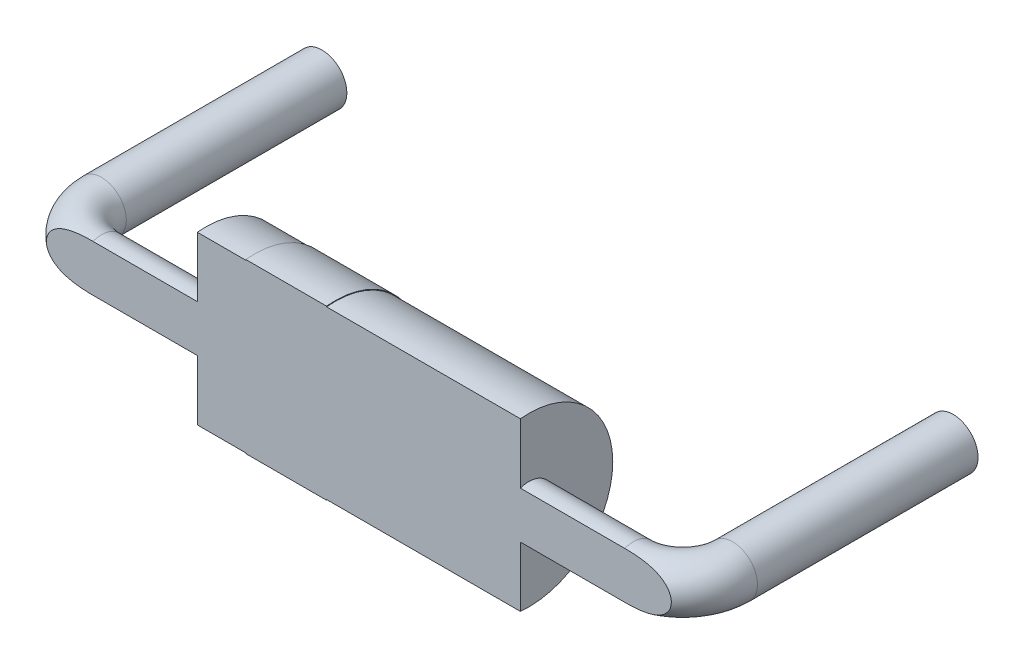
ISO-10303-21;
HEADER;
FILE_DESCRIPTION(('STEP AP214'),'2;1');
FILE_NAME('part.step','',(''),(''),'','','');
FILE_SCHEMA(('AUTOMOTIVE_DESIGN { 1 0 10303 214 1 1 1 1 }'));
ENDSEC;
DATA;
#1=APPLICATION_CONTEXT('core data for automotive mechanical design processes');
#2=APPLICATION_PROTOCOL_DEFINITION('international standard','automotive_design',2000,#1);
#3=PRODUCT_CONTEXT('',#1,'mechanical');
#4=PRODUCT('Part','Part','',(#3));
#5=PRODUCT_RELATED_PRODUCT_CATEGORY('part','',(#4));
#6=PRODUCT_DEFINITION_FORMATION('','',#4);
#7=PRODUCT_DEFINITION_CONTEXT('part definition',#1,'design');
#8=PRODUCT_DEFINITION('design','',#6,#7);
#9=PRODUCT_DEFINITION_SHAPE('','',#8);
#10=(LENGTH_UNIT() NAMED_UNIT(*) SI_UNIT(.MILLI.,.METRE.));
#11=(NAMED_UNIT(*) PLANE_ANGLE_UNIT() SI_UNIT($,.RADIAN.));
#12=(NAMED_UNIT(*) SI_UNIT($,.STERADIAN.) SOLID_ANGLE_UNIT());
#13=UNCERTAINTY_MEASURE_WITH_UNIT(LENGTH_MEASURE(1.E-05),#10,'distance_accuracy_value','');
#14=(GEOMETRIC_REPRESENTATION_CONTEXT(3) GLOBAL_UNCERTAINTY_ASSIGNED_CONTEXT((#13)) GLOBAL_UNIT_ASSIGNED_CONTEXT((#10,
#11,#12)) REPRESENTATION_CONTEXT('',''));
#15=CARTESIAN_POINT('',(0.,0.,0.));
#16=DIRECTION('',(0.,0.,1.));
#17=DIRECTION('',(1.,0.,0.));
#18=AXIS2_PLACEMENT_3D('',#15,#16,#17);
#19=CARTESIAN_POINT('',(10.16,-0.4,-2.5));
#20=DIRECTION('',(0.,0.,1.));
#21=DIRECTION('',(1.,0.,0.));
#22=AXIS2_PLACEMENT_3D('',#19,#20,#21);
#23=PLANE('',#22);
#24=CARTESIAN_POINT('',(10.16,-1.30268481103693E-13,-2.5));
#25=DIRECTION('',(0.,0.,-1.));
#26=DIRECTION('',(-0.829113924050761,-0.559079691050524,0.));
#27=AXIS2_PLACEMENT_3D('',#24,#25,#26);
#28=CIRCLE('',#27,0.400000000000038);
#29=CARTESIAN_POINT('',(9.76,0.,-2.5));
#30=VERTEX_POINT('',#29);
#31=EDGE_CURVE('E11',#30,#30,#28,.T.);
#32=ORIENTED_EDGE('',*,*,#31,.T.);
#33=EDGE_LOOP('',(#32));
#34=FACE_BOUND('',#33,.T.);
#35=ADVANCED_FACE('F17',(#34),#23,.F.);
#36=CARTESIAN_POINT('',(0.,-0.4,-2.5));
#37=DIRECTION('',(0.,0.,-1.));
#38=DIRECTION('',(0.,-1.,0.));
#39=AXIS2_PLACEMENT_3D('',#36,#37,#38);
#40=PLANE('',#39);
#41=CARTESIAN_POINT('',(0.,-1.33384425739838E-13,-2.5));
#42=DIRECTION('',(0.,0.,1.));
#43=DIRECTION('',(0.829113924050766,-0.559079691050516,0.));
#44=AXIS2_PLACEMENT_3D('',#41,#42,#43);
#45=CIRCLE('',#44,0.400000000000038);
#46=CARTESIAN_POINT('',(0.4,0.,-2.5));
#47=VERTEX_POINT('',#46);
#48=EDGE_CURVE('E156',#47,#47,#45,.T.);
#49=ORIENTED_EDGE('',*,*,#48,.F.);
#50=EDGE_LOOP('',(#49));
#51=FACE_BOUND('',#50,.T.);
#52=ADVANCED_FACE('F19',(#51),#40,.T.);
#53=CARTESIAN_POINT('',(10.1599999999998,0.,1.05));
#54=DIRECTION('',(0.,0.,1.));
#55=DIRECTION('',(1.,-5.51108286165929E-13,0.));
#56=AXIS2_PLACEMENT_3D('',#53,#54,#55);
#57=CYLINDRICAL_SURFACE('',#56,0.400000000000236);
#58=CARTESIAN_POINT('',(10.16,1.3246638275554E-13,1.05));
#59=DIRECTION('',(0.,0.,1.));
#60=DIRECTION('',(-0.829113924050646,0.559079691050694,0.));
#61=AXIS2_PLACEMENT_3D('',#58,#59,#60);
#62=CIRCLE('',#61,0.400000000000038);
#63=CARTESIAN_POINT('',(9.76,0.,1.05));
#64=VERTEX_POINT('',#63);
#65=EDGE_CURVE('E291',#64,#64,#62,.T.);
#66=ORIENTED_EDGE('',*,*,#65,.F.);
#67=DIRECTION('',(0.,0.,-1.));
#68=VECTOR('',#67,1.);
#69=CARTESIAN_POINT('',(9.75999999999953,2.20550891258329E-13,1.05));
#70=LINE('',#69,#68);
#71=EDGE_CURVE('E28',#64,#30,#70,.T.);
#72=ORIENTED_EDGE('',*,*,#71,.T.);
#73=ORIENTED_EDGE('',*,*,#31,.F.);
#74=ORIENTED_EDGE('',*,*,#71,.F.);
#75=EDGE_LOOP('',(#66,#72,#73,#74));
#76=FACE_BOUND('',#75,.T.);
#77=ADVANCED_FACE('F367',(#76),#57,.T.);
#78=CARTESIAN_POINT('',(2.35020336525338E-13,0.,-2.5));
#79=DIRECTION('',(0.,0.,-1.));
#80=DIRECTION('',(-1.,-5.51477655248606E-13,0.));
#81=AXIS2_PLACEMENT_3D('',#78,#79,#80);
#82=CYLINDRICAL_SURFACE('',#81,0.400000000000235);
#83=ORIENTED_EDGE('',*,*,#48,.T.);
#84=DIRECTION('',(0.,0.,1.));
#85=VECTOR('',#84,1.);
#86=CARTESIAN_POINT('',(0.40000000000047,2.20568830768313E-13,-2.5));
#87=LINE('',#86,#85);
#88=CARTESIAN_POINT('',(0.4,0.,1.05));
#89=VERTEX_POINT('',#88);
#90=EDGE_CURVE('E160',#47,#89,#87,.T.);
#91=ORIENTED_EDGE('',*,*,#90,.T.);
#92=CARTESIAN_POINT('',(0.,-1.32922599687569E-13,1.05));
#93=DIRECTION('',(0.,0.,1.));
#94=DIRECTION('',(0.829113924050766,-0.559079691050516,0.));
#95=AXIS2_PLACEMENT_3D('',#92,#93,#94);
#96=CIRCLE('',#95,0.400000000000038);
#97=EDGE_CURVE('E123',#89,#89,#96,.T.);
#98=ORIENTED_EDGE('',*,*,#97,.F.);
#99=ORIENTED_EDGE('',*,*,#90,.F.);
#100=EDGE_LOOP('',(#83,#91,#98,#99));
#101=FACE_BOUND('',#100,.T.);
#102=ADVANCED_FACE('F372',(#101),#82,.T.);
#103=CARTESIAN_POINT('',(7.68,0.,1.84999999999977));
#104=DIRECTION('',(-1.,0.,0.));
#105=DIRECTION('',(0.,1.03805409001884E-13,-1.));
#106=AXIS2_PLACEMENT_3D('',#103,#104,#105);
#107=CYLINDRICAL_SURFACE('',#106,0.400000000000234);
#108=DIRECTION('',(-1.,0.,0.));
#109=VECTOR('',#108,1.);
#110=CARTESIAN_POINT('',(7.68,-0.375807131385399,1.987));
#111=LINE('',#110,#109);
#112=CARTESIAN_POINT('',(9.36,-0.375807131385423,1.987));
#113=VERTEX_POINT('',#112);
#114=CARTESIAN_POINT('',(7.68,-0.375807131385423,1.987));
#115=VERTEX_POINT('',#114);
#116=EDGE_CURVE('E282',#113,#115,#111,.T.);
#117=ORIENTED_EDGE('',*,*,#116,.T.);
#118=CARTESIAN_POINT('',(7.68,-1.32685403529592E-13,1.85000000000004));
#119=DIRECTION('',(1.,0.,0.));
#120=DIRECTION('',(0.,-0.559079691050516,-0.829113924050766));
#121=AXIS2_PLACEMENT_3D('',#118,#119,#120);
#122=CIRCLE('',#121,0.400000000000038);
#123=CARTESIAN_POINT('',(7.68,0.375807131385157,1.987));
#124=VERTEX_POINT('',#123);
#125=EDGE_CURVE('E153',#115,#124,#122,.T.);
#126=ORIENTED_EDGE('',*,*,#125,.T.);
#127=DIRECTION('',(1.,0.,0.));
#128=VECTOR('',#127,1.);
#129=CARTESIAN_POINT('',(7.68,0.3758071313854,1.987));
#130=LINE('',#129,#128);
#131=CARTESIAN_POINT('',(9.36,0.375807131385157,1.987));
#132=VERTEX_POINT('',#131);
#133=EDGE_CURVE('E287',#124,#132,#130,.T.);
#134=ORIENTED_EDGE('',*,*,#133,.T.);
#135=CARTESIAN_POINT('',(9.36,-1.32685403529592E-13,1.85000000000004));
#136=DIRECTION('',(1.,0.,0.));
#137=DIRECTION('',(0.,-0.559079691050516,-0.829113924050766));
#138=AXIS2_PLACEMENT_3D('',#135,#136,#137);
#139=CIRCLE('',#138,0.400000000000038);
#140=CARTESIAN_POINT('',(9.36,2.00776801527536E-13,1.45));
#141=VERTEX_POINT('',#140);
#142=EDGE_CURVE('E130',#141,#132,#139,.T.);
#143=ORIENTED_EDGE('',*,*,#142,.F.);
#144=CARTESIAN_POINT('',(9.36,-1.32685403529592E-13,1.85000000000004));
#145=DIRECTION('',(1.,0.,0.));
#146=DIRECTION('',(0.,-0.559079691050516,-0.829113924050766));
#147=AXIS2_PLACEMENT_3D('',#144,#145,#146);
#148=CIRCLE('',#147,0.400000000000038);
#149=EDGE_CURVE('E250',#113,#141,#148,.T.);
#150=ORIENTED_EDGE('',*,*,#149,.F.);
#151=EDGE_LOOP('',(#117,#126,#134,#143,#150));
#152=FACE_BOUND('',#151,.T.);
#153=ADVANCED_FACE('F378',(#152),#107,.T.);
#154=CARTESIAN_POINT('',(7.68,1.35,1.85));
#155=DIRECTION('',(1.,0.,0.));
#156=DIRECTION('',(0.,1.,0.));
#157=AXIS2_PLACEMENT_3D('',#154,#155,#156);
#158=PLANE('',#157);
#159=DIRECTION('',(0.,-1.,0.));
#160=VECTOR('',#159,1.);
#161=CARTESIAN_POINT('',(7.68,8.17225999999577,1.987));
#162=LINE('',#161,#160);
#163=CARTESIAN_POINT('',(7.68,-1.34303052832018,1.987));
#164=VERTEX_POINT('',#163);
#165=EDGE_CURVE('E278',#115,#164,#162,.T.);
#166=ORIENTED_EDGE('',*,*,#165,.T.);
#167=CARTESIAN_POINT('',(7.68,0.,1.85));
#168=DIRECTION('',(1.,0.,0.));
#169=DIRECTION('',(0.,0.559079691050539,0.829113924050751));
#170=AXIS2_PLACEMENT_3D('',#167,#168,#169);
#171=CIRCLE('',#170,1.35);
#172=CARTESIAN_POINT('',(7.68,1.3430305283202,1.987));
#173=VERTEX_POINT('',#172);
#174=EDGE_CURVE('E150',#164,#173,#171,.T.);
#175=ORIENTED_EDGE('',*,*,#174,.T.);
#176=DIRECTION('',(0.,-1.,0.));
#177=VECTOR('',#176,1.);
#178=CARTESIAN_POINT('',(7.68,8.17225999999577,1.987));
#179=LINE('',#178,#177);
#180=EDGE_CURVE('E283',#173,#124,#179,.T.);
#181=ORIENTED_EDGE('',*,*,#180,.T.);
#182=ORIENTED_EDGE('',*,*,#125,.F.);
#183=EDGE_LOOP('',(#166,#175,#181,#182));
#184=FACE_BOUND('',#183,.T.);
#185=ADVANCED_FACE('F382',(#184),#158,.T.);
#186=CARTESIAN_POINT('',(4.56,0.,1.85));
#187=DIRECTION('',(-1.,0.,0.));
#188=DIRECTION('',(0.,5.51439225670582E-13,-1.));
#189=AXIS2_PLACEMENT_3D('',#186,#187,#188);
#190=CYLINDRICAL_SURFACE('',#189,1.35);
#191=DIRECTION('',(-1.,0.,0.));
#192=VECTOR('',#191,1.);
#193=CARTESIAN_POINT('',(4.56,-1.3430305283202,1.987));
#194=LINE('',#193,#192);
#195=CARTESIAN_POINT('',(4.56,-1.34303052832018,1.987));
#196=VERTEX_POINT('',#195);
#197=EDGE_CURVE('E271',#164,#196,#194,.T.);
#198=ORIENTED_EDGE('',*,*,#197,.T.);
#199=CARTESIAN_POINT('',(4.56,0.,1.85));
#200=DIRECTION('',(1.,0.,0.));
#201=DIRECTION('',(0.,0.559079691050539,0.829113924050751));
#202=AXIS2_PLACEMENT_3D('',#199,#200,#201);
#203=CIRCLE('',#202,1.35);
#204=CARTESIAN_POINT('',(4.56,1.3430305283202,1.987));
#205=VERTEX_POINT('',#204);
#206=EDGE_CURVE('E147',#196,#205,#203,.T.);
#207=ORIENTED_EDGE('',*,*,#206,.T.);
#208=DIRECTION('',(1.,0.,0.));
#209=VECTOR('',#208,1.);
#210=CARTESIAN_POINT('',(4.56,1.3430305283202,1.987));
#211=LINE('',#210,#209);
#212=EDGE_CURVE('E251',#205,#173,#211,.T.);
#213=ORIENTED_EDGE('',*,*,#212,.T.);
#214=ORIENTED_EDGE('',*,*,#174,.F.);
#215=EDGE_LOOP('',(#198,#207,#213,#214));
#216=FACE_BOUND('',#215,.T.);
#217=ADVANCED_FACE('F387',(#216),#190,.T.);
#218=CARTESIAN_POINT('',(4.56,1.36,1.85));
#219=DIRECTION('',(1.,0.,0.));
#220=DIRECTION('',(0.,1.,0.));
#221=AXIS2_PLACEMENT_3D('',#218,#219,#220);
#222=PLANE('',#221);
#223=DIRECTION('',(0.,-1.,0.));
#224=VECTOR('',#223,1.);
#225=CARTESIAN_POINT('',(4.56,8.17725999999577,1.987));
#226=LINE('',#225,#224);
#227=CARTESIAN_POINT('',(4.56,-1.35308203742412,1.987));
#228=VERTEX_POINT('',#227);
#229=EDGE_CURVE('E267',#196,#228,#226,.T.);
#230=ORIENTED_EDGE('',*,*,#229,.T.);
#231=CARTESIAN_POINT('',(4.56,0.,1.84999999999997));
#232=DIRECTION('',(1.,0.,0.));
#233=DIRECTION('',(0.,0.559079691050534,0.829113924050754));
#234=AXIS2_PLACEMENT_3D('',#231,#232,#233);
#235=CIRCLE('',#234,1.36000000000003);
#236=CARTESIAN_POINT('',(4.56,1.35308203742432,1.987));
#237=VERTEX_POINT('',#236);
#238=EDGE_CURVE('E146',#228,#237,#235,.T.);
#239=ORIENTED_EDGE('',*,*,#238,.T.);
#240=DIRECTION('',(0.,-1.,0.));
#241=VECTOR('',#240,1.);
#242=CARTESIAN_POINT('',(4.56,8.17725999999577,1.987));
#243=LINE('',#242,#241);
#244=EDGE_CURVE('E246',#237,#205,#243,.T.);
#245=ORIENTED_EDGE('',*,*,#244,.T.);
#246=ORIENTED_EDGE('',*,*,#206,.F.);
#247=EDGE_LOOP('',(#230,#239,#245,#246));
#248=FACE_BOUND('',#247,.T.);
#249=ADVANCED_FACE('F395',(#248),#222,.T.);
#250=CARTESIAN_POINT('',(3.26,0.,1.85000000000017));
#251=DIRECTION('',(-1.,0.,0.));
#252=DIRECTION('',(0.,5.51533034688997E-13,-1.));
#253=AXIS2_PLACEMENT_3D('',#250,#251,#252);
#254=CYLINDRICAL_SURFACE('',#253,1.36000000000017);
#255=DIRECTION('',(-1.,0.,0.));
#256=VECTOR('',#255,1.);
#257=CARTESIAN_POINT('',(3.26,-1.35308203742438,1.987));
#258=LINE('',#257,#256);
#259=CARTESIAN_POINT('',(3.26,-1.35308203742412,1.987));
#260=VERTEX_POINT('',#259);
#261=EDGE_CURVE('E256',#228,#260,#258,.T.);
#262=ORIENTED_EDGE('',*,*,#261,.T.);
#263=CARTESIAN_POINT('',(3.26,0.,1.84999999999997));
#264=DIRECTION('',(1.,0.,0.));
#265=DIRECTION('',(0.,0.559079691050534,0.829113924050754));
#266=AXIS2_PLACEMENT_3D('',#263,#264,#265);
#267=CIRCLE('',#266,1.36000000000003);
#268=CARTESIAN_POINT('',(3.26,1.35308203742432,1.987));
#269=VERTEX_POINT('',#268);
#270=EDGE_CURVE('E142',#260,#269,#267,.T.);
#271=ORIENTED_EDGE('',*,*,#270,.T.);
#272=DIRECTION('',(1.,0.,0.));
#273=VECTOR('',#272,1.);
#274=CARTESIAN_POINT('',(3.26,1.35308203742438,1.987));
#275=LINE('',#274,#273);
#276=EDGE_CURVE('E355',#269,#237,#275,.T.);
#277=ORIENTED_EDGE('',*,*,#276,.T.);
#278=ORIENTED_EDGE('',*,*,#238,.F.);
#279=EDGE_LOOP('',(#262,#271,#277,#278));
#280=FACE_BOUND('',#279,.T.);
#281=ADVANCED_FACE('F392',(#280),#254,.T.);
#282=CARTESIAN_POINT('',(3.26,1.36,1.85));
#283=DIRECTION('',(1.,0.,0.));
#284=DIRECTION('',(0.,1.,0.));
#285=AXIS2_PLACEMENT_3D('',#282,#283,#284);
#286=PLANE('',#285);
#287=DIRECTION('',(0.,1.,0.));
#288=VECTOR('',#287,1.);
#289=CARTESIAN_POINT('',(3.26,8.17725999999577,1.987));
#290=LINE('',#289,#288);
#291=CARTESIAN_POINT('',(3.26,-1.34303052832018,1.987));
#292=VERTEX_POINT('',#291);
#293=EDGE_CURVE('E252',#260,#292,#290,.T.);
#294=ORIENTED_EDGE('',*,*,#293,.T.);
#295=CARTESIAN_POINT('',(3.26,0.,1.85));
#296=DIRECTION('',(1.,0.,0.));
#297=DIRECTION('',(0.,0.559079691050539,0.829113924050751));
#298=AXIS2_PLACEMENT_3D('',#295,#296,#297);
#299=CIRCLE('',#298,1.35);
#300=CARTESIAN_POINT('',(3.26,1.3430305283202,1.987));
#301=VERTEX_POINT('',#300);
#302=EDGE_CURVE('E138',#292,#301,#299,.T.);
#303=ORIENTED_EDGE('',*,*,#302,.T.);
#304=DIRECTION('',(0.,1.,0.));
#305=VECTOR('',#304,1.);
#306=CARTESIAN_POINT('',(3.26,8.17725999999577,1.987));
#307=LINE('',#306,#305);
#308=EDGE_CURVE('E242',#301,#269,#307,.T.);
#309=ORIENTED_EDGE('',*,*,#308,.T.);
#310=ORIENTED_EDGE('',*,*,#270,.F.);
#311=EDGE_LOOP('',(#294,#303,#309,#310));
#312=FACE_BOUND('',#311,.T.);
#313=ADVANCED_FACE('F349',(#312),#286,.F.);
#314=CARTESIAN_POINT('',(2.48,0.,1.85));
#315=DIRECTION('',(-1.,0.,0.));
#316=DIRECTION('',(0.,5.51439225670582E-13,-1.));
#317=AXIS2_PLACEMENT_3D('',#314,#315,#316);
#318=CYLINDRICAL_SURFACE('',#317,1.35);
#319=DIRECTION('',(-1.,0.,0.));
#320=VECTOR('',#319,1.);
#321=CARTESIAN_POINT('',(2.48,-1.3430305283202,1.987));
#322=LINE('',#321,#320);
#323=CARTESIAN_POINT('',(2.48,-1.34303052832018,1.987));
#324=VERTEX_POINT('',#323);
#325=EDGE_CURVE('E257',#292,#324,#322,.T.);
#326=ORIENTED_EDGE('',*,*,#325,.T.);
#327=CARTESIAN_POINT('',(2.48,0.,1.85));
#328=DIRECTION('',(1.,0.,0.));
#329=DIRECTION('',(0.,0.559079691050539,0.829113924050751));
#330=AXIS2_PLACEMENT_3D('',#327,#328,#329);
#331=CIRCLE('',#330,1.35);
#332=CARTESIAN_POINT('',(2.48,1.3430305283202,1.987));
#333=VERTEX_POINT('',#332);
#334=EDGE_CURVE('E137',#324,#333,#331,.T.);
#335=ORIENTED_EDGE('',*,*,#334,.T.);
#336=DIRECTION('',(1.,0.,0.));
#337=VECTOR('',#336,1.);
#338=CARTESIAN_POINT('',(2.48,1.3430305283202,1.987));
#339=LINE('',#338,#337);
#340=EDGE_CURVE('E232',#333,#301,#339,.T.);
#341=ORIENTED_EDGE('',*,*,#340,.T.);
#342=ORIENTED_EDGE('',*,*,#302,.F.);
#343=EDGE_LOOP('',(#326,#335,#341,#342));
#344=FACE_BOUND('',#343,.T.);
#345=ADVANCED_FACE('F300',(#344),#318,.T.);
#346=CARTESIAN_POINT('',(2.48,1.35,1.85));
#347=DIRECTION('',(1.,0.,0.));
#348=DIRECTION('',(0.,1.,0.));
#349=AXIS2_PLACEMENT_3D('',#346,#347,#348);
#350=PLANE('',#349);
#351=DIRECTION('',(0.,1.,0.));
#352=VECTOR('',#351,1.);
#353=CARTESIAN_POINT('',(2.48,8.17225999999577,1.987));
#354=LINE('',#353,#352);
#355=CARTESIAN_POINT('',(2.48,-0.375807131385423,1.987));
#356=VERTEX_POINT('',#355);
#357=EDGE_CURVE('E218',#324,#356,#354,.T.);
#358=ORIENTED_EDGE('',*,*,#357,.T.);
#359=CARTESIAN_POINT('',(2.48,-1.32685403529592E-13,1.85000000000004));
#360=DIRECTION('',(1.,0.,0.));
#361=DIRECTION('',(0.,-0.559079691050516,-0.829113924050766));
#362=AXIS2_PLACEMENT_3D('',#359,#360,#361);
#363=CIRCLE('',#362,0.400000000000038);
#364=CARTESIAN_POINT('',(2.48,0.375807131385157,1.987));
#365=VERTEX_POINT('',#364);
#366=EDGE_CURVE('E111',#356,#365,#363,.T.);
#367=ORIENTED_EDGE('',*,*,#366,.T.);
#368=DIRECTION('',(0.,1.,0.));
#369=VECTOR('',#368,1.);
#370=CARTESIAN_POINT('',(2.48,8.17225999999577,1.987));
#371=LINE('',#370,#369);
#372=EDGE_CURVE('E224',#365,#333,#371,.T.);
#373=ORIENTED_EDGE('',*,*,#372,.T.);
#374=ORIENTED_EDGE('',*,*,#334,.F.);
#375=EDGE_LOOP('',(#358,#367,#373,#374));
#376=FACE_BOUND('',#375,.T.);
#377=ADVANCED_FACE('F307',(#376),#350,.F.);
#378=CARTESIAN_POINT('',(0.8,0.,1.84999999999977));
#379=DIRECTION('',(-1.,0.,0.));
#380=DIRECTION('',(0.,0.,-1.));
#381=AXIS2_PLACEMENT_3D('',#378,#379,#380);
#382=CYLINDRICAL_SURFACE('',#381,0.400000000000234);
#383=DIRECTION('',(-1.,0.,0.));
#384=VECTOR('',#383,1.);
#385=CARTESIAN_POINT('',(0.8,-0.375807131385399,1.987));
#386=LINE('',#385,#384);
#387=CARTESIAN_POINT('',(0.8,-0.375807131385156,1.987));
#388=VERTEX_POINT('',#387);
#389=EDGE_CURVE('E119',#356,#388,#386,.T.);
#390=ORIENTED_EDGE('',*,*,#389,.T.);
#391=CARTESIAN_POINT('',(0.8,1.34345632277326E-13,1.85000000000004));
#392=DIRECTION('',(-1.,0.,0.));
#393=DIRECTION('',(0.,0.559079691050689,-0.82911392405065));
#394=AXIS2_PLACEMENT_3D('',#391,#392,#393);
#395=CIRCLE('',#394,0.400000000000039);
#396=CARTESIAN_POINT('',(0.8,3.15740936118773E-13,1.45));
#397=VERTEX_POINT('',#396);
#398=EDGE_CURVE('E112',#397,#388,#395,.T.);
#399=ORIENTED_EDGE('',*,*,#398,.F.);
#400=CARTESIAN_POINT('',(0.8,1.34345632277326E-13,1.85000000000004));
#401=DIRECTION('',(-1.,0.,0.));
#402=DIRECTION('',(0.,0.559079691050689,-0.82911392405065));
#403=AXIS2_PLACEMENT_3D('',#400,#401,#402);
#404=CIRCLE('',#403,0.400000000000039);
#405=CARTESIAN_POINT('',(0.8,0.375807131385425,1.987));
#406=VERTEX_POINT('',#405);
#407=EDGE_CURVE('E96',#406,#397,#404,.T.);
#408=ORIENTED_EDGE('',*,*,#407,.F.);
#409=DIRECTION('',(1.,0.,0.));
#410=VECTOR('',#409,1.);
#411=CARTESIAN_POINT('',(0.8,0.3758071313854,1.987));
#412=LINE('',#411,#410);
#413=EDGE_CURVE('E222',#406,#365,#412,.T.);
#414=ORIENTED_EDGE('',*,*,#413,.T.);
#415=ORIENTED_EDGE('',*,*,#366,.F.);
#416=EDGE_LOOP('',(#390,#399,#408,#414,#415));
#417=FACE_BOUND('',#416,.T.);
#418=ADVANCED_FACE('F115',(#417),#382,.T.);
#419=CARTESIAN_POINT('',(0.800000000000452,4.09902651291485E-13,1.04999999999959));
#420=DIRECTION('',(5.39276475171912E-13,-1.,-2.3552675261084E-13));
#421=DIRECTION('',(0.,2.3552675261084E-13,-1.));
#422=AXIS2_PLACEMENT_3D('',#419,#420,#421);
#423=TOROIDAL_SURFACE('',#422,0.800000000000811,0.40000000000029);
#424=ORIENTED_EDGE('',*,*,#97,.T.);
#425=CARTESIAN_POINT('',(0.800000000000452,4.09951637163451E-13,1.04999999999959));
#426=DIRECTION('',(-5.39276475171912E-13,1.,2.3552675261084E-13));
#427=DIRECTION('',(0.,2.3552675261084E-13,-1.));
#428=AXIS2_PLACEMENT_3D('',#425,#426,#427);
#429=CIRCLE('',#428,0.400000000000522);
#430=EDGE_CURVE('E101',#89,#397,#429,.T.);
#431=ORIENTED_EDGE('',*,*,#430,.T.);
#432=ORIENTED_EDGE('',*,*,#398,.T.);
#433=CARTESIAN_POINT('',(0.800000000000653,-0.375807131385469,1.987));
#434=CARTESIAN_POINT('',(0.780528841916047,-0.375803095323342,1.98699425448905));
#435=CARTESIAN_POINT('',(0.761056403696661,-0.375596620173103,1.98696974335715));
#436=CARTESIAN_POINT('',(0.722381243543313,-0.374729349105902,1.98691687100429));
#437=CARTESIAN_POINT('',(0.703178382024851,-0.374074638030343,1.98688856538259));
#438=CARTESIAN_POINT('',(0.664904575963499,-0.372269319951529,1.98685995594487));
#439=CARTESIAN_POINT('',(0.645833501819237,-0.371121551673741,1.98685949394153));
#440=CARTESIAN_POINT('',(0.60769917008158,-0.368250773954323,1.98687477926883));
#441=CARTESIAN_POINT('',(0.588635989307905,-0.366526725653014,1.98689055598057));
#442=CARTESIAN_POINT('',(0.549859910865432,-0.362338027121628,1.98689526700373));
#443=CARTESIAN_POINT('',(0.530149722627002,-0.359847822039574,1.98688316305086));
#444=CARTESIAN_POINT('',(0.491192042843784,-0.354033361834085,1.98687291307622));
#445=CARTESIAN_POINT('',(0.471942392044172,-0.350724050833946,1.98687453259538));
#446=CARTESIAN_POINT('',(0.443314904801364,-0.345001931779365,1.9868943843606));
#447=CARTESIAN_POINT('',(0.433858407907444,-0.342979698432264,1.98690381900049));
#448=CARTESIAN_POINT('',(0.415052797186467,-0.33866832355984,1.98692607061514));
#449=CARTESIAN_POINT('',(0.405703387592825,-0.336380480559217,1.98693887149197));
#450=CARTESIAN_POINT('',(0.387114738824571,-0.331515942571136,1.98696467080144));
#451=CARTESIAN_POINT('',(0.3778752285861,-0.32894028657576,1.98697766838584));
#452=CARTESIAN_POINT('',(0.359511620200498,-0.323478987533922,1.98699640843331));
#453=CARTESIAN_POINT('',(0.350387301841466,-0.320594087264682,1.987002167876));
#454=CARTESIAN_POINT('',(0.331889939260803,-0.314361978982708,1.9870054283438));
#455=CARTESIAN_POINT('',(0.322521545712083,-0.311000894116745,1.98700258980264));
#456=CARTESIAN_POINT('',(0.304068515459645,-0.303922638193652,1.98699920687751));
#457=CARTESIAN_POINT('',(0.294981745360772,-0.300211051711195,1.98699863122427));
#458=CARTESIAN_POINT('',(0.27710999387877,-0.29241348043239,1.98700058841667));
#459=CARTESIAN_POINT('',(0.268322624817597,-0.288332990711078,1.9870030809449));
#460=CARTESIAN_POINT('',(0.251071722447217,-0.279779409770491,1.98701221430444));
#461=CARTESIAN_POINT('',(0.242605568069498,-0.275311619187258,1.9870188049815));
#462=CARTESIAN_POINT('',(0.226021373761647,-0.265966683230156,1.98703449239603));
#463=CARTESIAN_POINT('',(0.217900554008842,-0.261094503584094,1.98704356117592));
#464=CARTESIAN_POINT('',(0.205975600792913,-0.253452028014435,1.98705627197287));
#465=CARTESIAN_POINT('',(0.202057150171409,-0.250858886545309,1.9870603469275));
#466=CARTESIAN_POINT('',(0.19431793284874,-0.24556593054857,1.98706748328367));
#467=CARTESIAN_POINT('',(0.190496813252624,-0.242866633430905,1.98707054904968));
#468=CARTESIAN_POINT('',(0.182956432980859,-0.23736007318066,1.98707487626147));
#469=CARTESIAN_POINT('',(0.17923682761999,-0.234553282175215,1.98707614483526));
#470=CARTESIAN_POINT('',(0.171903621923791,-0.228830581268563,1.98707587089794));
#471=CARTESIAN_POINT('',(0.16828969280626,-0.225915093043692,1.987074338327));
#472=CARTESIAN_POINT('',(0.161172353069522,-0.219973916142691,1.98706752727278));
#473=CARTESIAN_POINT('',(0.157668636758498,-0.216948593928856,1.9870622603235));
#474=CARTESIAN_POINT('',(0.150775893529316,-0.210787511691636,1.9870460833042));
#475=CARTESIAN_POINT('',(0.147386594312215,-0.207652056373489,1.98703518781219));
#476=CARTESIAN_POINT('',(0.140365169988385,-0.20091964485128,1.98700726181085));
#477=CARTESIAN_POINT('',(0.136745918597714,-0.197309228476979,1.98698969918769));
#478=CARTESIAN_POINT('',(0.129708816777992,-0.189986489704025,1.98695365581001));
#479=CARTESIAN_POINT('',(0.126288964942426,-0.186276092866447,1.98693518989342));
#480=CARTESIAN_POINT('',(0.119655336868103,-0.178755858561391,1.98689847862158));
#481=CARTESIAN_POINT('',(0.116439547162949,-0.174947799509986,1.98688023333974));
#482=CARTESIAN_POINT('',(0.110219284988,-0.167234392550386,1.98684570520214));
#483=CARTESIAN_POINT('',(0.107212814022294,-0.163330658531398,1.98682940226286));
#484=CARTESIAN_POINT('',(0.10141616759022,-0.155428508868422,1.98679996038487));
#485=CARTESIAN_POINT('',(0.0986240518779615,-0.15143151846793,1.98678679001038));
#486=CARTESIAN_POINT('',(0.093261024655354,-0.143345722085888,1.98676455700769));
#487=CARTESIAN_POINT('',(0.0906882776556617,-0.13925813519809,1.98675545686449));
#488=CARTESIAN_POINT('',(0.0857687506733355,-0.130994325356142,1.98674195878092));
#489=CARTESIAN_POINT('',(0.0834202918033777,-0.126819103177243,1.98673752292042));
#490=CARTESIAN_POINT('',(0.078953952393144,-0.118383501640788,1.9867336065514));
#491=CARTESIAN_POINT('',(0.0768346044986303,-0.114123900150601,1.98673409235402));
#492=CARTESIAN_POINT('',(0.0728309229134609,-0.105523319679214,1.98673991421734));
#493=CARTESIAN_POINT('',(0.0709453895642526,-0.101182899778989,1.98674522424679));
#494=CARTESIAN_POINT('',(0.0674135793009237,-0.0924247580006701,1.98676022228371));
#495=CARTESIAN_POINT('',(0.0657664252959905,-0.088007390166881,1.98676989367357));
#496=CARTESIAN_POINT('',(0.0627154042690948,-0.079099718697578,1.98679276565665));
#497=CARTESIAN_POINT('',(0.0613110335302347,-0.0746095877381017,1.98680595879473));
#498=CARTESIAN_POINT('',(0.0587493810282432,-0.0655610408195506,1.98683464098877));
#499=CARTESIAN_POINT('',(0.0575920127905293,-0.0610026493582958,1.986850129238));
#500=CARTESIAN_POINT('',(0.0555279259668227,-0.0518225100362394,1.98688177922303));
#501=CARTESIAN_POINT('',(0.0546215723815462,-0.0472006800653755,1.98689794190065));
#502=CARTESIAN_POINT('',(0.0530628129492083,-0.0378988669164912,1.98692891820239));
#503=CARTESIAN_POINT('',(0.0524112459066779,-0.0332187431376489,1.98694372724952));
#504=CARTESIAN_POINT('',(0.0513651115126679,-0.0238058070012245,1.9869695933185));
#505=CARTESIAN_POINT('',(0.0509718657609885,-0.0190728477779209,1.98698063090935));
#506=CARTESIAN_POINT('',(0.0504450577529145,-0.00955999761458631,1.98699608215689));
#507=CARTESIAN_POINT('',(0.0503132940989618,-0.00478000736377227,1.98700044988802));
#508=CARTESIAN_POINT('',(0.0503121700705518,0.00477629935881971,1.98699955046098));
#509=CARTESIAN_POINT('',(0.0504426062207657,0.00955261580405805,1.98699429077428));
#510=CARTESIAN_POINT('',(0.0509668588316463,0.0190586221964008,1.98697744833873));
#511=CARTESIAN_POINT('',(0.0513588993959968,0.0237884097767777,1.98696590832056));
#512=CARTESIAN_POINT('',(0.0524026214527581,0.0331955174513554,1.98693927944483));
#513=CARTESIAN_POINT('',(0.0530530063164562,0.0378729814063166,1.98692420846182));
#514=CARTESIAN_POINT('',(0.0546094695946249,0.0471699956903977,1.98689293688129));
#515=CARTESIAN_POINT('',(0.0555147350793151,0.0517896821492814,1.98687673999652));
#516=CARTESIAN_POINT('',(0.0575767383315002,0.0609660577705179,1.98684520041047));
#517=CARTESIAN_POINT('',(0.058733137675762,0.0655228230192252,1.98682985659423));
#518=CARTESIAN_POINT('',(0.0612929810649072,0.0745686396664593,1.98680160207662));
#519=CARTESIAN_POINT('',(0.0626965384053649,0.079057658981721,1.98678869249673));
#520=CARTESIAN_POINT('',(0.065746093363448,0.0879636246439104,1.98676648400054));
#521=CARTESIAN_POINT('',(0.0673926213279058,0.0923803892363945,1.98675719314873));
#522=CARTESIAN_POINT('',(0.0709233720919445,0.101137833920679,1.98674301096972));
#523=CARTESIAN_POINT('',(0.0728084980072679,0.105478149538679,1.98673813696485));
#524=CARTESIAN_POINT('',(0.0768115875675355,0.114079019439898,1.98673320034921));
#525=CARTESIAN_POINT('',(0.0789307759215953,0.11833900306378,1.98673316437439));
#526=CARTESIAN_POINT('',(0.0833970477060939,0.126775852340441,1.98673795220956));
#527=CARTESIAN_POINT('',(0.0857456222624914,0.130951927643794,1.98674281003247));
#528=CARTESIAN_POINT('',(0.0906656587757011,0.139217909582864,1.98675708278977));
#529=CARTESIAN_POINT('',(0.0932388218829459,0.143306802324685,1.98676653552972));
#530=CARTESIAN_POINT('',(0.0986029834922577,0.151395656238807,1.9867893630311));
#531=CARTESIAN_POINT('',(0.101395838081115,0.155394384836869,1.98680277461742));
#532=CARTESIAN_POINT('',(0.107194287347929,0.163300432532431,1.9868325491374));
#533=CARTESIAN_POINT('',(0.110201841136097,0.167206312787189,1.98684894215932));
#534=CARTESIAN_POINT('',(0.116424608473726,0.174924413167539,1.98688345358173));
#535=CARTESIAN_POINT('',(0.119641837572764,0.178735005980136,1.98690158990198));
#536=CARTESIAN_POINT('',(0.126278716627887,0.186260663578325,1.98693787061807));
#537=CARTESIAN_POINT('',(0.12970039557097,0.189973936638985,1.98695601227589));
#538=CARTESIAN_POINT('',(0.136741472202527,0.197302821326386,1.98699106075788));
#539=CARTESIAN_POINT('',(0.140362884363371,0.200916495402724,1.98700794810883));
#540=CARTESIAN_POINT('',(0.147383552583008,0.207650003752202,1.98703454856357));
#541=CARTESIAN_POINT('',(0.150769737047458,0.210783500928407,1.98704480305476));
#542=CARTESIAN_POINT('',(0.157656655525598,0.216940960607419,1.98705998785752));
#543=CARTESIAN_POINT('',(0.161157673110021,0.219964605872654,1.98706490377646));
#544=CARTESIAN_POINT('',(0.168269976310892,0.225902773618713,1.98707118470509));
#545=CARTESIAN_POINT('',(0.17188157818729,0.228816917036684,1.98707253833198));
#546=CARTESIAN_POINT('',(0.179210519529245,0.234537243381584,1.98707261865179));
#547=CARTESIAN_POINT('',(0.182928197755194,0.237342991907496,1.98707133570733));
#548=CARTESIAN_POINT('',(0.190465121195311,0.242847773126061,1.98706710682516));
#549=CARTESIAN_POINT('',(0.194284720401779,0.245546321006341,1.98706415408931));
#550=CARTESIAN_POINT('',(0.202021305674887,0.250838068653659,1.98705734195038));
#551=CARTESIAN_POINT('',(0.205938653254158,0.253430738434803,1.98705347851845));
#552=CARTESIAN_POINT('',(0.217861541644451,0.261072612624454,1.98704150338547));
#553=CARTESIAN_POINT('',(0.225981448681888,0.265944601904365,1.98703305933775));
#554=CARTESIAN_POINT('',(0.242565496896903,0.275290179438558,1.9870186510742));
#555=CARTESIAN_POINT('',(0.251032470510217,0.279758708271591,1.98701271561906));
#556=CARTESIAN_POINT('',(0.268286709473015,0.288314669292223,1.98700466692182));
#557=CARTESIAN_POINT('',(0.277076638748827,0.292396714590214,1.9870026017796));
#558=CARTESIAN_POINT('',(0.294955218801406,0.300198123844085,1.98700111739463));
#559=CARTESIAN_POINT('',(0.304046291507696,0.30391191435644,1.98700173386637));
#560=CARTESIAN_POINT('',(0.322509545317295,0.310995349745091,1.98700431362668));
#561=CARTESIAN_POINT('',(0.331883885832303,0.314359343057848,1.98700629596257));
#562=CARTESIAN_POINT('',(0.350380770993495,0.320592459590556,1.98700133693995));
#563=CARTESIAN_POINT('',(0.359498501606235,0.323475943585607,1.98699474735918));
#564=CARTESIAN_POINT('',(0.377850880034313,0.328934897530727,1.98697516447522));
#565=CARTESIAN_POINT('',(0.387085767763809,0.33150955841164,1.986962154789));
#566=CARTESIAN_POINT('',(0.405667055125608,0.33637268759361,1.98693666899193));
#567=CARTESIAN_POINT('',(0.415013741739337,0.338660055962724,1.98692419504533));
#568=CARTESIAN_POINT('',(0.433815786230205,0.342970953872006,1.98690278708387));
#569=CARTESIAN_POINT('',(0.443271452556506,0.344993129335035,1.98689387079538));
#570=CARTESIAN_POINT('',(0.47190194538092,0.350716211105244,1.98687564061507));
#571=CARTESIAN_POINT('',(0.491155482905287,0.354026278294048,1.98687519238861));
#572=CARTESIAN_POINT('',(0.530127892724685,0.359843926896747,1.98688556918304));
#573=CARTESIAN_POINT('',(0.549848968267528,0.362336262043739,1.98689659394538));
#574=CARTESIAN_POINT('',(0.588630018821861,0.366526641989712,1.98688928053208));
#575=CARTESIAN_POINT('',(0.6076872194248,0.368250843045419,1.98687202210469));
#576=CARTESIAN_POINT('',(0.645813584596878,0.371121779096769,1.98685562831265));
#577=CARTESIAN_POINT('',(0.664882681024001,0.372269435294757,1.9868564639425));
#578=CARTESIAN_POINT('',(0.703156494236286,0.374074709846296,1.98688614962106));
#579=CARTESIAN_POINT('',(0.722361345322286,0.374729385455666,1.9869151655692));
#580=CARTESIAN_POINT('',(0.761044464151492,0.375596671962637,1.98696922897772));
#581=CARTESIAN_POINT('',(0.780522873617465,0.375803104558558,1.98699421663273));
#582=CARTESIAN_POINT('',(0.800000000000247,0.375807131385912,1.987));
#583=B_SPLINE_CURVE_WITH_KNOTS('',3,(#433,#434,#435,#436,#437,#438,#439,#440,#441,#442,#443,
#444,#445,#446,#447,#448,#449,#450,#451,#452,#453,#454,#455,#456,#457,#458,#459,#460,#461,#462,
#463,#464,#465,#466,#467,#468,#469,#470,#471,#472,#473,#474,#475,#476,#477,#478,#479,#480,#481,
#482,#483,#484,#485,#486,#487,#488,#489,#490,#491,#492,#493,#494,#495,#496,#497,#498,#499,#500,
#501,#502,#503,#504,#505,#506,#507,#508,#509,#510,#511,#512,#513,#514,#515,#516,#517,#518,#519,
#520,#521,#522,#523,#524,#525,#526,#527,#528,#529,#530,#531,#532,#533,#534,#535,#536,#537,#538,
#539,#540,#541,#542,#543,#544,#545,#546,#547,#548,#549,#550,#551,#552,#553,#554,#555,#556,#557,
#558,#559,#560,#561,#562,#563,#564,#565,#566,#567,#568,#569,#570,#571,#572,#573,#574,#575,#576,
#577,#578,#579,#580,#581,#582),.UNSPECIFIED.,.F.,.F.,(4,2,2,2,2,2,2,2,2,2,2,2,2,2,2,2,2,2,2,2,2,
2,2,2,2,2,2,2,2,2,2,2,2,2,2,2,2,2,2,2,2,2,2,2,2,2,2,2,2,2,2,2,2,2,2,2,2,2,2,2,2,2,2,2,2,2,2,2,2,
2,2,2,2,2,4),(0.,0.0584143683484649,0.116051082191075,0.173360314831953,0.230773421025852,
0.290358952628403,0.348928572881735,0.377936065716896,0.40680728571812,0.435577457959769,
0.46428001283014,0.49413071749325,0.52356745505912,0.552621475102212,0.581326738663563,
0.609720648266524,0.623815231198277,0.637848032573772,0.65182501977574,0.665752504403693,
0.679637158957226,0.693486030987345,0.708818223752369,0.723951833065372,0.738899779325596,
0.753676516046123,0.768298038505021,0.782781868882871,0.797147014654737,0.811413897580047,
0.825604251514343,0.839740988441887,0.853848033545938,0.867950131698886,0.882072629334169,
0.896241237099906,0.910481779834452,0.924819941116643,0.939146979828403,0.953377735958188,
0.967537952634455,0.981653507852304,0.995750157962061,1.00985328678323,1.02398766763431,
1.03817724483672,1.05244494009096,1.06681248766632,1.08130030075209,1.0959273697433,
1.11071119181309,1.12566772994955,1.14081139875984,1.15615507377576,1.1699930929478,
1.18386832708529,1.19778784399211,1.21175833097517,1.22578610910511,1.23987715004493,
1.26826841095883,1.2969768811222,1.32603983049324,1.35549102502269,1.38536146422159,
1.4140438954315,1.44279990081281,1.47166284711319,1.50066786171817,1.55924937272066,
1.61886811137331,1.67626338586765,1.73356666027549,1.79120934061638,1.84964161779432),.UNSPECIFIED.);
#584=EDGE_CURVE('E105',#388,#406,#583,.T.);
#585=ORIENTED_EDGE('',*,*,#584,.T.);
#586=ORIENTED_EDGE('',*,*,#407,.T.);
#587=ORIENTED_EDGE('',*,*,#430,.F.);
#588=EDGE_LOOP('',(#424,#431,#432,#585,#586,#587));
#589=FACE_BOUND('',#588,.T.);
#590=ADVANCED_FACE('F99',(#589),#423,.T.);
#591=CARTESIAN_POINT('',(9.35999999999959,4.21555988640152E-13,1.04999999999955));
#592=DIRECTION('',(-2.44501537389461E-13,-1.,-5.5207043246058E-13));
#593=DIRECTION('',(0.,5.5207043246058E-13,-1.));
#594=AXIS2_PLACEMENT_3D('',#591,#592,#593);
#595=TOROIDAL_SURFACE('',#594,0.800000000000811,0.40000000000029);
#596=CARTESIAN_POINT('',(9.35999999999968,0.375807131385656,1.987));
#597=CARTESIAN_POINT('',(9.37947115808439,0.375803095323514,1.98699425448905));
#598=CARTESIAN_POINT('',(9.39894359630387,0.375596620173261,1.98696974335714));
#599=CARTESIAN_POINT('',(9.43761875645735,0.374729349106031,1.98691687100426));
#600=CARTESIAN_POINT('',(9.45682161797585,0.374074638030458,1.98688856538255));
#601=CARTESIAN_POINT('',(9.4950954240372,0.372269319951619,1.98685995594481));
#602=CARTESIAN_POINT('',(9.51416649818142,0.37112155167382,1.98685949394146));
#603=CARTESIAN_POINT('',(9.55230082991894,0.368250773954372,1.98687477926878));
#604=CARTESIAN_POINT('',(9.57136401069251,0.366526725653046,1.98689055598055));
#605=CARTESIAN_POINT('',(9.61014008913529,0.362338027121587,1.98689526700375));
#606=CARTESIAN_POINT('',(9.62985027737414,0.359847822039458,1.98688316305087));
#607=CARTESIAN_POINT('',(9.66880795715791,0.354033361833848,1.98687291307619));
#608=CARTESIAN_POINT('',(9.68805760795766,0.350724050833676,1.98687453259529));
#609=CARTESIAN_POINT('',(9.71668509520058,0.345001931779044,1.98689438436045));
#610=CARTESIAN_POINT('',(9.72614159209446,0.342979698431939,1.98690381900033));
#611=CARTESIAN_POINT('',(9.7449472028153,0.338668323559519,1.98692607061496));
#612=CARTESIAN_POINT('',(9.75429661240884,0.336380480558905,1.98693887149178));
#613=CARTESIAN_POINT('',(9.77288526117681,0.331515942570856,1.98696467080126));
#614=CARTESIAN_POINT('',(9.78212477141511,0.328940286575505,1.98697766838567));
#615=CARTESIAN_POINT('',(9.80048837980028,0.323478987533727,1.98699640843321));
#616=CARTESIAN_POINT('',(9.80961269815906,0.320594087264524,1.98700216787595));
#617=CARTESIAN_POINT('',(9.82811006073964,0.314361978982494,1.98700542834385));
#618=CARTESIAN_POINT('',(9.83747845428852,0.311000894116424,1.98700258980274));
#619=CARTESIAN_POINT('',(9.85593148454124,0.303922638193138,1.98699920687768));
#620=CARTESIAN_POINT('',(9.86501825464023,0.300211051710598,1.98699863122446));
#621=CARTESIAN_POINT('',(9.88289000612242,0.292413480431649,1.98700058841687));
#622=CARTESIAN_POINT('',(9.89167737518366,0.288332990710276,1.9870030809451));
#623=CARTESIAN_POINT('',(9.90892827755412,0.279779409769595,1.98701221430462));
#624=CARTESIAN_POINT('',(9.91739443193186,0.275311619186331,1.98701880498166));
#625=CARTESIAN_POINT('',(9.9339786262397,0.265966683229196,1.98703449239615));
#626=CARTESIAN_POINT('',(9.94209944599248,0.261094503583136,1.98704356117602));
#627=CARTESIAN_POINT('',(9.95402439920835,0.253452028013491,1.98705627197294));
#628=CARTESIAN_POINT('',(9.95794284982982,0.250858886544379,1.98706034692755));
#629=CARTESIAN_POINT('',(9.96568206715241,0.245565930547677,1.9870674832837));
#630=CARTESIAN_POINT('',(9.96950318674848,0.242866633430036,1.9870705490497));
#631=CARTESIAN_POINT('',(9.97704356702015,0.237360073179847,1.98707487626147));
#632=CARTESIAN_POINT('',(9.98076317238096,0.234553282174436,1.98707614483526));
#633=CARTESIAN_POINT('',(9.98809637807704,0.228830581267862,1.98707587089793));
#634=CARTESIAN_POINT('',(9.9917103071945,0.225915093043035,1.98707433832698));
#635=CARTESIAN_POINT('',(9.9988276469311,0.219973916142134,1.98706752727275));
#636=CARTESIAN_POINT('',(10.002331363242,0.216948593928355,1.98706226032348));
#637=CARTESIAN_POINT('',(10.0092241064711,0.210787511691257,1.98704608330418));
#638=CARTESIAN_POINT('',(10.0126134056881,0.207652056373177,1.98703518781217));
#639=CARTESIAN_POINT('',(10.0196348300117,0.20091964485115,1.98700726181085));
#640=CARTESIAN_POINT('',(10.0232540814022,0.197309228476965,1.98698969918771));
#641=CARTESIAN_POINT('',(10.0302911832217,0.189986489704232,1.98695365581006));
#642=CARTESIAN_POINT('',(10.0337110350571,0.186276092866758,1.98693518989349));
#643=CARTESIAN_POINT('',(10.0403446631313,0.178755858561898,1.98689847862169));
#644=CARTESIAN_POINT('',(10.0435604528363,0.174947799510584,1.98688023333987));
#645=CARTESIAN_POINT('',(10.0497807150111,0.167234392551153,1.98684570520232));
#646=CARTESIAN_POINT('',(10.0527871859767,0.163330658532242,1.98682940226307));
#647=CARTESIAN_POINT('',(10.0585838324087,0.155428508869407,1.98679996038514));
#648=CARTESIAN_POINT('',(10.0613759481209,0.151431518468977,1.98678679001067));
#649=CARTESIAN_POINT('',(10.0667389753434,0.143345722087044,1.98676455700804));
#650=CARTESIAN_POINT('',(10.0693117223431,0.139258135199293,1.98675545686487));
#651=CARTESIAN_POINT('',(10.0742312493253,0.130994325357422,1.98674195878135));
#652=CARTESIAN_POINT('',(10.0765797081953,0.126819103178553,1.98673752292087));
#653=CARTESIAN_POINT('',(10.0810460476055,0.118383501642141,1.9867336065519));
#654=CARTESIAN_POINT('',(10.0831653955,0.114123900151967,1.98673409235454));
#655=CARTESIAN_POINT('',(10.0871690770852,0.105523319680589,1.98673991421789));
#656=CARTESIAN_POINT('',(10.0890546104344,0.101182899780358,1.98674522424736));
#657=CARTESIAN_POINT('',(10.0925864206978,0.0924247580020121,1.9867602222843));
#658=CARTESIAN_POINT('',(10.0942335747027,0.0880073901681998,1.98676989367417));
#659=CARTESIAN_POINT('',(10.0972845957297,0.0790997186988323,1.98679276565726));
#660=CARTESIAN_POINT('',(10.0986889664686,0.0746095877393143,1.98680595879533));
#661=CARTESIAN_POINT('',(10.1012506189707,0.0655610408206614,1.98683464098936));
#662=CARTESIAN_POINT('',(10.1024079872085,0.061002649359346,1.98685012923858));
#663=CARTESIAN_POINT('',(10.1044720740323,0.0518225100371498,1.98688177922357));
#664=CARTESIAN_POINT('',(10.1053784276176,0.0472006800662065,1.98689794190117));
#665=CARTESIAN_POINT('',(10.1069371870501,0.0378988669171448,1.98692891820284));
#666=CARTESIAN_POINT('',(10.1075887540927,0.0332187431382043,1.98694372724994));
#667=CARTESIAN_POINT('',(10.1086348884869,0.0238058070015646,1.98696959331883));
#668=CARTESIAN_POINT('',(10.1090281342386,0.0190728477781441,1.98698063090963));
#669=CARTESIAN_POINT('',(10.1095549422469,0.0095599976145573,1.98699608215704));
#670=CARTESIAN_POINT('',(10.1096867059009,0.00478000736360798,1.98700044988809));
#671=CARTESIAN_POINT('',(10.1096878299295,-0.00477629935912269,1.98699955046091));
#672=CARTESIAN_POINT('',(10.1095573937794,-0.00955261580436442,1.98699429077413));
#673=CARTESIAN_POINT('',(10.1090331411687,-0.0190586221967133,1.98697744833845));
#674=CARTESIAN_POINT('',(10.1086411006044,-0.0237884097770928,1.98696590832021));
#675=CARTESIAN_POINT('',(10.1075973785478,-0.033195517451675,1.98693927944436));
#676=CARTESIAN_POINT('',(10.1069469936841,-0.037872981406638,1.98692420846129));
#677=CARTESIAN_POINT('',(10.1053905304061,-0.0471699956907224,1.98689293688067));
#678=CARTESIAN_POINT('',(10.1044852649215,-0.0517896821496075,1.98687673999586));
#679=CARTESIAN_POINT('',(10.1024232616694,-0.0609660577708457,1.98684520040973));
#680=CARTESIAN_POINT('',(10.1012668623251,-0.0655228230195534,1.98682985659345));
#681=CARTESIAN_POINT('',(10.0987070189361,-0.0745686396667876,1.98680160207578));
#682=CARTESIAN_POINT('',(10.0973034615956,-0.0790576589820492,1.98678869249587));
#683=CARTESIAN_POINT('',(10.0942539066376,-0.0879636246442375,1.98676648399965));
#684=CARTESIAN_POINT('',(10.0926073786731,-0.0923803892367206,1.98675719314783));
#685=CARTESIAN_POINT('',(10.0890766279091,-0.101137833921003,1.9867430109688));
#686=CARTESIAN_POINT('',(10.0871915019938,-0.105478149539001,1.98673813696392));
#687=CARTESIAN_POINT('',(10.0831884124335,-0.114079019440216,1.98673320034828));
#688=CARTESIAN_POINT('',(10.0810692240794,-0.118339003064096,1.98673316437347));
#689=CARTESIAN_POINT('',(10.0766029522949,-0.126775852340752,1.98673795220867));
#690=CARTESIAN_POINT('',(10.0742543777385,-0.130951927644101,1.98674281003159));
#691=CARTESIAN_POINT('',(10.0693343412252,-0.139217909583165,1.98675708278894));
#692=CARTESIAN_POINT('',(10.066761178118,-0.143306802324981,1.98676653552891));
#693=CARTESIAN_POINT('',(10.0613970165086,-0.151395656239096,1.98678936303036));
#694=CARTESIAN_POINT('',(10.0586041619197,-0.155394384837154,1.98680277461671));
#695=CARTESIAN_POINT('',(10.0528057126527,-0.163300432532707,1.98683254913677));
#696=CARTESIAN_POINT('',(10.0497981588645,-0.16720631278746,1.98684894215874));
#697=CARTESIAN_POINT('',(10.0435753915268,-0.1749244131678,1.98688345358123));
#698=CARTESIAN_POINT('',(10.0403581624277,-0.17873500598039,1.98690158990154));
#699=CARTESIAN_POINT('',(10.0337212833724,-0.186260663578569,1.98693787061775));
#700=CARTESIAN_POINT('',(10.0302996044292,-0.189973936639224,1.98695601227562));
#701=CARTESIAN_POINT('',(10.0232585277975,-0.197302821326611,1.98699106075774));
#702=CARTESIAN_POINT('',(10.0196371156365,-0.200916495402942,1.98700794810876));
#703=CARTESIAN_POINT('',(10.0126164474167,-0.207650003752402,1.98703454856363));
#704=CARTESIAN_POINT('',(10.0092302629522,-0.210783500928599,1.98704480305487));
#705=CARTESIAN_POINT('',(10.0023433444739,-0.216940960607596,1.98705998785774));
#706=CARTESIAN_POINT('',(9.99884232688941,-0.219964605872825,1.98706490377674));
#707=CARTESIAN_POINT('',(9.99173002368841,-0.22590277361887,1.98707118470545));
#708=CARTESIAN_POINT('',(9.98811842181195,-0.228816917036835,1.98707253833238));
#709=CARTESIAN_POINT('',(9.98078948046989,-0.234537243381724,1.98707261865227));
#710=CARTESIAN_POINT('',(9.97707180224389,-0.237342991907631,1.98707133570784));
#711=CARTESIAN_POINT('',(9.96953487880369,-0.242847773126186,1.98706710682572));
#712=CARTESIAN_POINT('',(9.96571527959718,-0.245546321006462,1.98706415408989));
#713=CARTESIAN_POINT('',(9.95797869432401,-0.250838068653771,1.987057341951));
#714=CARTESIAN_POINT('',(9.95406134674471,-0.253430738434911,1.98705347851908));
#715=CARTESIAN_POINT('',(9.94213845835436,-0.261072612624545,1.98704150338614));
#716=CARTESIAN_POINT('',(9.9340185513169,-0.265944601904451,1.98703305933842));
#717=CARTESIAN_POINT('',(9.91743450310188,-0.275290179438634,1.98701865107486));
#718=CARTESIAN_POINT('',(9.90896752948859,-0.279758708271665,1.98701271561969));
#719=CARTESIAN_POINT('',(9.89171329052587,-0.288314669292292,1.98700466692238));
#720=CARTESIAN_POINT('',(9.88292336125012,-0.292396714590283,1.98700260178012));
#721=CARTESIAN_POINT('',(9.8650447811977,-0.300198123844153,1.98700111739503));
#722=CARTESIAN_POINT('',(9.85595370849151,-0.303911914356507,1.98700173386671));
#723=CARTESIAN_POINT('',(9.83749045468216,-0.310995349745163,1.98700431362685));
#724=CARTESIAN_POINT('',(9.8281161141673,-0.314359343057926,1.98700629596265));
#725=CARTESIAN_POINT('',(9.80961922900654,-0.320592459590592,1.98700133693986));
#726=CARTESIAN_POINT('',(9.80050149839408,-0.323475943585599,1.98699474735903));
#727=CARTESIAN_POINT('',(9.78214911996649,-0.328934897530645,1.98697516447496));
#728=CARTESIAN_POINT('',(9.77291423223719,-0.331509558411526,1.98696215478872));
#729=CARTESIAN_POINT('',(9.75433294487572,-0.336372687593446,1.98693666899162));
#730=CARTESIAN_POINT('',(9.74498625826211,-0.338660055962542,1.98692419504501));
#731=CARTESIAN_POINT('',(9.72618421377139,-0.3429709538718,1.98690278708356));
#732=CARTESIAN_POINT('',(9.71672854744513,-0.344993129334821,1.98689387079509));
#733=CARTESIAN_POINT('',(9.68809805462059,-0.350716211105048,1.98687564061484));
#734=CARTESIAN_POINT('',(9.66884451709605,-0.354026278293859,1.98687519238845));
#735=CARTESIAN_POINT('',(9.62987210727601,-0.359843926896619,1.98688556918299));
#736=CARTESIAN_POINT('',(9.61015103173269,-0.362336262043651,1.98689659394536));
#737=CARTESIAN_POINT('',(9.57136998117786,-0.36652664198964,1.9868892805321));
#738=CARTESIAN_POINT('',(9.55231278057491,-0.368250843045338,1.9868720221047));
#739=CARTESIAN_POINT('',(9.51418641540281,-0.371121779096665,1.98685562831266));
#740=CARTESIAN_POINT('',(9.49511731897568,-0.37226943529464,1.98685646394251));
#741=CARTESIAN_POINT('',(9.4568435057634,-0.374074709846152,1.98688614962107));
#742=CARTESIAN_POINT('',(9.43763865467741,-0.374729385455508,1.98691516556921));
#743=CARTESIAN_POINT('',(9.39895553584822,-0.375596671962451,1.98696922897772));
#744=CARTESIAN_POINT('',(9.37947712638227,-0.375803104558358,1.98699421663273));
#745=CARTESIAN_POINT('',(9.3599999999995,-0.375807131385696,1.987));
#746=B_SPLINE_CURVE_WITH_KNOTS('',3,(#596,#597,#598,#599,#600,#601,#602,#603,#604,#605,#606,
#607,#608,#609,#610,#611,#612,#613,#614,#615,#616,#617,#618,#619,#620,#621,#622,#623,#624,#625,
#626,#627,#628,#629,#630,#631,#632,#633,#634,#635,#636,#637,#638,#639,#640,#641,#642,#643,#644,
#645,#646,#647,#648,#649,#650,#651,#652,#653,#654,#655,#656,#657,#658,#659,#660,#661,#662,#663,
#664,#665,#666,#667,#668,#669,#670,#671,#672,#673,#674,#675,#676,#677,#678,#679,#680,#681,#682,
#683,#684,#685,#686,#687,#688,#689,#690,#691,#692,#693,#694,#695,#696,#697,#698,#699,#700,#701,
#702,#703,#704,#705,#706,#707,#708,#709,#710,#711,#712,#713,#714,#715,#716,#717,#718,#719,#720,
#721,#722,#723,#724,#725,#726,#727,#728,#729,#730,#731,#732,#733,#734,#735,#736,#737,#738,#739,
#740,#741,#742,#743,#744,#745),.UNSPECIFIED.,.F.,.F.,(4,2,2,2,2,2,2,2,2,2,2,2,2,2,2,2,2,2,2,2,2,
2,2,2,2,2,2,2,2,2,2,2,2,2,2,2,2,2,2,2,2,2,2,2,2,2,2,2,2,2,2,2,2,2,2,2,2,2,2,2,2,2,2,2,2,2,2,2,2,
2,2,2,2,2,4),(0.,0.058414368348767,0.116051082191477,0.17336031483225,0.230773421025841,
0.290358952629647,0.34892857288342,0.377936065718482,0.406807285719396,0.435577457960513,
0.464280012830132,0.494130717493812,0.523567455060102,0.552621475103456,0.581326738664904,
0.609720648267789,0.623815231199437,0.637848032574783,0.651825019776557,0.66575250440427,
0.67963715895752,0.693486030987311,0.708818223751803,0.723951833064344,0.738899779324178,
0.753676516044386,0.768298038503037,0.782781868880711,0.797147014652471,0.811413897577745,
0.825604251512071,0.83974098843971,0.853848033543918,0.867950131697083,0.882072629332637,
0.896241237098697,0.910481779833613,0.924819941116218,0.939146979827981,0.953377735957755,
0.967537952634002,0.981653507851824,0.995750157961554,1.0098532867827,1.02398766763376,
1.03817724483616,1.05244494009041,1.06681248766579,1.0813003007516,1.09592736974289,
1.11071119181277,1.12566772994936,1.14081139875979,1.1561550737759,1.1699930929481,
1.18386832708574,1.19778784399268,1.21175833097586,1.22578610910588,1.23987715004576,
1.26826841095971,1.29697688112303,1.32603983049391,1.35549102502307,1.38536146422157,
1.41404389543062,1.44279990081133,1.47166284711135,1.50066786171621,1.5592493727192,
1.61886811137329,1.67626338586767,1.73356666027552,1.79120934061639,1.84964161779428),.UNSPECIFIED.);
#747=EDGE_CURVE('E171',#132,#113,#746,.T.);
#748=ORIENTED_EDGE('',*,*,#747,.T.);
#749=ORIENTED_EDGE('',*,*,#149,.T.);
#750=CARTESIAN_POINT('',(9.35999999999959,4.21604974512118E-13,1.04999999999955));
#751=DIRECTION('',(2.44501537389461E-13,1.,5.5207043246058E-13));
#752=DIRECTION('',(0.,5.5207043246058E-13,-1.));
#753=AXIS2_PLACEMENT_3D('',#750,#751,#752);
#754=CIRCLE('',#753,0.400000000000521);
#755=EDGE_CURVE('E294',#141,#64,#754,.T.);
#756=ORIENTED_EDGE('',*,*,#755,.T.);
#757=ORIENTED_EDGE('',*,*,#65,.T.);
#758=ORIENTED_EDGE('',*,*,#755,.F.);
#759=ORIENTED_EDGE('',*,*,#142,.T.);
#760=EDGE_LOOP('',(#748,#749,#756,#757,#758,#759));
#761=FACE_BOUND('',#760,.T.);
#762=ADVANCED_FACE('F178',(#761),#595,.T.);
#763=CARTESIAN_POINT('',(16.0755206618068,14.9945199999915,1.987));
#764=DIRECTION('',(0.,0.,-1.));
#765=DIRECTION('',(-1.,0.,0.));
#766=AXIS2_PLACEMENT_3D('',#763,#764,#765);
#767=PLANE('',#766);
#768=ORIENTED_EDGE('',*,*,#276,.F.);
#769=ORIENTED_EDGE('',*,*,#308,.F.);
#770=ORIENTED_EDGE('',*,*,#340,.F.);
#771=ORIENTED_EDGE('',*,*,#372,.F.);
#772=ORIENTED_EDGE('',*,*,#413,.F.);
#773=ORIENTED_EDGE('',*,*,#584,.F.);
#774=ORIENTED_EDGE('',*,*,#389,.F.);
#775=ORIENTED_EDGE('',*,*,#357,.F.);
#776=ORIENTED_EDGE('',*,*,#325,.F.);
#777=ORIENTED_EDGE('',*,*,#293,.F.);
#778=ORIENTED_EDGE('',*,*,#261,.F.);
#779=ORIENTED_EDGE('',*,*,#229,.F.);
#780=ORIENTED_EDGE('',*,*,#197,.F.);
#781=ORIENTED_EDGE('',*,*,#165,.F.);
#782=ORIENTED_EDGE('',*,*,#116,.F.);
#783=ORIENTED_EDGE('',*,*,#747,.F.);
#784=ORIENTED_EDGE('',*,*,#133,.F.);
#785=ORIENTED_EDGE('',*,*,#180,.F.);
#786=ORIENTED_EDGE('',*,*,#212,.F.);
#787=ORIENTED_EDGE('',*,*,#244,.F.);
#788=EDGE_LOOP('',(#768,#769,#770,#771,#772,#773,#774,#775,#776,#777,#778,#779,#780,#781,#782,
#783,#784,#785,#786,#787));
#789=FACE_BOUND('',#788,.T.);
#790=ADVANCED_FACE('F188',(#789),#767,.F.);
#791=CLOSED_SHELL('',(#35,#52,#77,#102,#153,#185,#217,#249,#281,#313,#345,#377,#418,#590,#762,#790));
#792=MANIFOLD_SOLID_BREP('B1',#791);
#793=ADVANCED_BREP_SHAPE_REPRESENTATION('',(#18,#792),#14);
#794=SHAPE_DEFINITION_REPRESENTATION(#9,#793);
ENDSEC;
END-ISO-10303-21;
